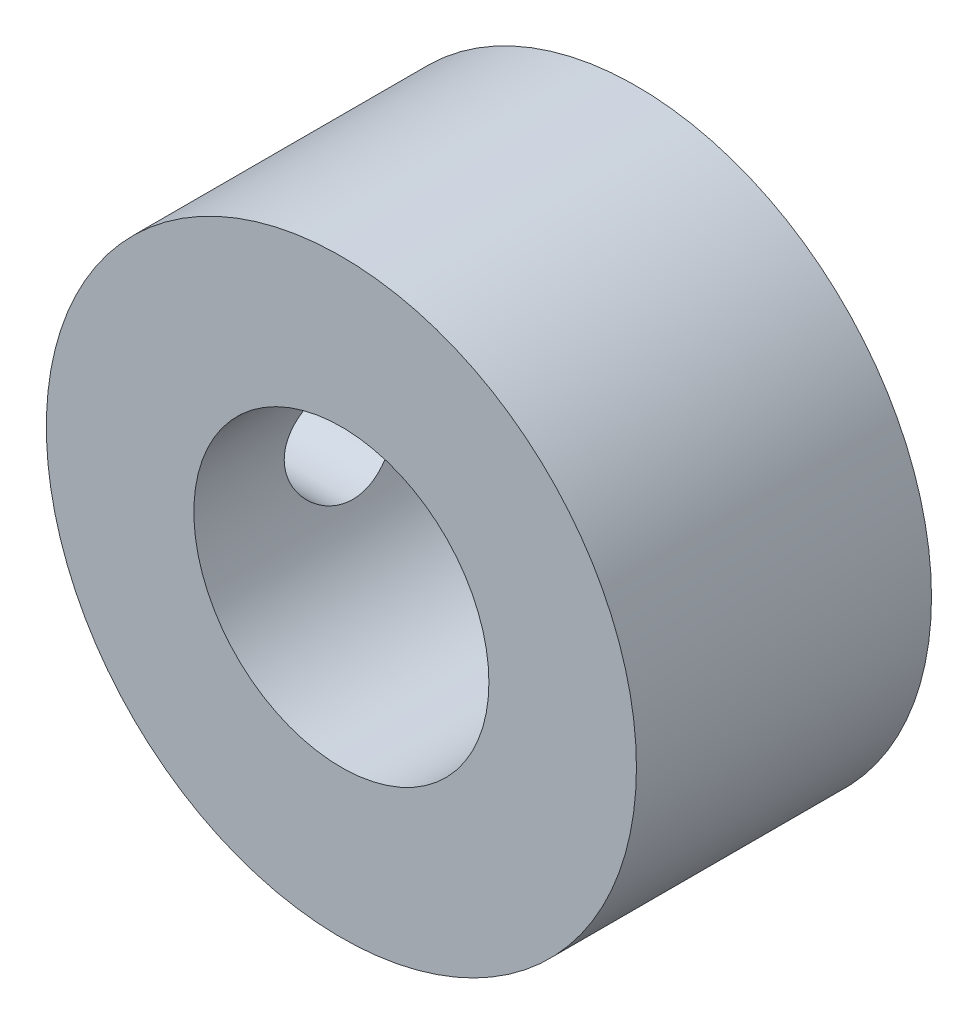
ISO-10303-21;
HEADER;
FILE_DESCRIPTION(('STEP AP214'),'2;1');
FILE_NAME('part.step','',(''),(''),'','','');
FILE_SCHEMA(('AUTOMOTIVE_DESIGN { 1 0 10303 214 1 1 1 1 }'));
ENDSEC;
DATA;
#1=APPLICATION_CONTEXT('core data for automotive mechanical design processes');
#2=APPLICATION_PROTOCOL_DEFINITION('international standard','automotive_design',2000,#1);
#3=PRODUCT_CONTEXT('',#1,'mechanical');
#4=PRODUCT('Part','Part','',(#3));
#5=PRODUCT_RELATED_PRODUCT_CATEGORY('part','',(#4));
#6=PRODUCT_DEFINITION_FORMATION('','',#4);
#7=PRODUCT_DEFINITION_CONTEXT('part definition',#1,'design');
#8=PRODUCT_DEFINITION('design','',#6,#7);
#9=PRODUCT_DEFINITION_SHAPE('','',#8);
#10=(LENGTH_UNIT() NAMED_UNIT(*) SI_UNIT(.MILLI.,.METRE.));
#11=(NAMED_UNIT(*) PLANE_ANGLE_UNIT() SI_UNIT($,.RADIAN.));
#12=(NAMED_UNIT(*) SI_UNIT($,.STERADIAN.) SOLID_ANGLE_UNIT());
#13=UNCERTAINTY_MEASURE_WITH_UNIT(LENGTH_MEASURE(1.E-05),#10,'distance_accuracy_value','');
#14=(GEOMETRIC_REPRESENTATION_CONTEXT(3) GLOBAL_UNCERTAINTY_ASSIGNED_CONTEXT((#13)) GLOBAL_UNIT_ASSIGNED_CONTEXT((#10,
#11,#12)) REPRESENTATION_CONTEXT('',''));
#15=CARTESIAN_POINT('',(0.,0.,0.));
#16=DIRECTION('',(0.,0.,1.));
#17=DIRECTION('',(1.,0.,0.));
#18=AXIS2_PLACEMENT_3D('',#15,#16,#17);
#19=CARTESIAN_POINT('',(0.,0.,8.));
#20=DIRECTION('',(0.,0.,1.));
#21=DIRECTION('',(1.,0.,0.));
#22=AXIS2_PLACEMENT_3D('',#19,#20,#21);
#23=PLANE('',#22);
#24=CARTESIAN_POINT('',(0.,0.,8.));
#25=DIRECTION('',(0.,0.,1.));
#26=DIRECTION('',(1.,0.,0.));
#27=AXIS2_PLACEMENT_3D('',#24,#25,#26);
#28=CIRCLE('',#27,8.);
#29=CARTESIAN_POINT('',(8.,0.,8.));
#30=VERTEX_POINT('',#29);
#31=EDGE_CURVE('E10',#30,#30,#28,.T.);
#32=ORIENTED_EDGE('',*,*,#31,.T.);
#33=EDGE_LOOP('',(#32));
#34=FACE_BOUND('',#33,.T.);
#35=CARTESIAN_POINT('',(0.,0.,8.));
#36=DIRECTION('',(0.,0.,1.));
#37=DIRECTION('',(1.,0.,0.));
#38=AXIS2_PLACEMENT_3D('',#35,#36,#37);
#39=CIRCLE('',#38,4.);
#40=CARTESIAN_POINT('',(4.,0.,8.));
#41=VERTEX_POINT('',#40);
#42=EDGE_CURVE('E57',#41,#41,#39,.T.);
#43=ORIENTED_EDGE('',*,*,#42,.F.);
#44=EDGE_LOOP('',(#43));
#45=FACE_BOUND('',#44,.T.);
#46=ADVANCED_FACE('F37',(#34,#45),#23,.T.);
#47=CARTESIAN_POINT('',(0.,0.,0.));
#48=DIRECTION('',(0.,0.,1.));
#49=DIRECTION('',(1.,0.,0.));
#50=AXIS2_PLACEMENT_3D('',#47,#48,#49);
#51=PLANE('',#50);
#52=CARTESIAN_POINT('',(0.,0.,0.));
#53=DIRECTION('',(0.,0.,1.));
#54=DIRECTION('',(1.,0.,0.));
#55=AXIS2_PLACEMENT_3D('',#52,#53,#54);
#56=CIRCLE('',#55,8.);
#57=CARTESIAN_POINT('',(8.,0.,0.));
#58=VERTEX_POINT('',#57);
#59=EDGE_CURVE('E51',#58,#58,#56,.T.);
#60=ORIENTED_EDGE('',*,*,#59,.F.);
#61=EDGE_LOOP('',(#60));
#62=FACE_BOUND('',#61,.T.);
#63=CARTESIAN_POINT('',(0.,0.,0.));
#64=DIRECTION('',(0.,0.,1.));
#65=DIRECTION('',(1.,0.,0.));
#66=AXIS2_PLACEMENT_3D('',#63,#64,#65);
#67=CIRCLE('',#66,4.);
#68=CARTESIAN_POINT('',(4.,0.,0.));
#69=VERTEX_POINT('',#68);
#70=EDGE_CURVE('E59',#69,#69,#67,.T.);
#71=ORIENTED_EDGE('',*,*,#70,.T.);
#72=EDGE_LOOP('',(#71));
#73=FACE_BOUND('',#72,.T.);
#74=ADVANCED_FACE('F82',(#62,#73),#51,.F.);
#75=CARTESIAN_POINT('',(0.,0.,8.));
#76=DIRECTION('',(0.,0.,-1.));
#77=DIRECTION('',(-1.,0.,0.));
#78=AXIS2_PLACEMENT_3D('',#75,#76,#77);
#79=CYLINDRICAL_SURFACE('',#78,8.);
#80=CARTESIAN_POINT('',(-8.,0.,2.45));
#81=CARTESIAN_POINT('',(-7.99999842280321,-0.0862000090560727,2.45000323506234));
#82=CARTESIAN_POINT('',(-7.99859244950264,-0.172441514582273,2.45721504765267));
#83=CARTESIAN_POINT('',(-7.99311930778483,-0.342490617447966,2.48585104477911));
#84=CARTESIAN_POINT('',(-7.98904995831119,-0.426296161166576,2.50728687765917));
#85=CARTESIAN_POINT('',(-7.97870487543911,-0.588989793717811,2.5636869294052));
#86=CARTESIAN_POINT('',(-7.97243119476004,-0.66788237741285,2.59863856510776));
#87=CARTESIAN_POINT('',(-7.95836101466986,-0.818677267895582,2.6810415234324));
#88=CARTESIAN_POINT('',(-7.95056462242915,-0.890580066100291,2.72849196645419));
#89=CARTESIAN_POINT('',(-7.93419720784637,-1.02627735016224,2.83518732487059));
#90=CARTESIAN_POINT('',(-7.92561835612107,-1.08996986367007,2.89456074275676));
#91=CARTESIAN_POINT('',(-7.90871045383984,-1.20655602201015,3.02314032180938));
#92=CARTESIAN_POINT('',(-7.90038142202523,-1.25944885837717,3.09234721845414));
#93=CARTESIAN_POINT('',(-7.88483993293564,-1.35336324284206,3.2393562115293));
#94=CARTESIAN_POINT('',(-7.87763756031106,-1.39428014474203,3.3172263197497));
#95=CARTESIAN_POINT('',(-7.86527562393695,-1.46241103269187,3.47889847196981));
#96=CARTESIAN_POINT('',(-7.86011587147091,-1.48962628469255,3.56269996712837));
#97=CARTESIAN_POINT('',(-7.85250239060556,-1.52925220095508,3.7327619824027));
#98=CARTESIAN_POINT('',(-7.85001608747069,-1.54184123479369,3.81897945321316));
#99=CARTESIAN_POINT('',(-7.84793288411762,-1.55241119677999,3.99233591578889));
#100=CARTESIAN_POINT('',(-7.8483357069624,-1.55039352505244,4.07947481843084));
#101=CARTESIAN_POINT('',(-7.85195561402892,-1.53195177741561,4.2509020793753));
#102=CARTESIAN_POINT('',(-7.85513291659774,-1.51573133777981,4.33521330911359));
#103=CARTESIAN_POINT('',(-7.8638812199749,-1.46966555159005,4.49989471565601));
#104=CARTESIAN_POINT('',(-7.86945232872296,-1.43981959064035,4.58026471456298));
#105=CARTESIAN_POINT('',(-7.88240165698287,-1.36715315209463,4.73537365758859));
#106=CARTESIAN_POINT('',(-7.88979116772949,-1.32425119437673,4.81007344773184));
#107=CARTESIAN_POINT('',(-7.90553732992766,-1.22674814971849,4.95129032695716));
#108=CARTESIAN_POINT('',(-7.91389408590109,-1.17214579787347,5.01780653010425));
#109=CARTESIAN_POINT('',(-7.93080599268302,-1.0516977592376,5.1419438932694));
#110=CARTESIAN_POINT('',(-7.93936211336833,-0.985678079341879,5.19939623218059));
#111=CARTESIAN_POINT('',(-7.9555794764229,-0.844849674944187,5.30243672403183));
#112=CARTESIAN_POINT('',(-7.96324070862711,-0.770040850625477,5.34802474221201));
#113=CARTESIAN_POINT('',(-7.97682216610372,-0.613575982254087,5.42607051054377));
#114=CARTESIAN_POINT('',(-7.98273994653886,-0.531910527300614,5.45850984605129));
#115=CARTESIAN_POINT('',(-7.99214900770226,-0.364149126216177,5.50916215364845));
#116=CARTESIAN_POINT('',(-7.99564056396556,-0.278053684371442,5.52737674120598));
#117=CARTESIAN_POINT('',(-7.99976566694373,-0.105327839678056,5.54882554297746));
#118=CARTESIAN_POINT('',(-8.0004433137256,-0.0187271634665921,5.55229093090906));
#119=CARTESIAN_POINT('',(-7.99898639516866,0.153815986945028,5.54476428491212));
#120=CARTESIAN_POINT('',(-7.99685197777301,0.239758495532241,5.53377301155098));
#121=CARTESIAN_POINT('',(-7.99003828417804,0.407806296409092,5.49783717788485));
#122=CARTESIAN_POINT('',(-7.98538049876911,0.489937723225295,5.47301040007483));
#123=CARTESIAN_POINT('',(-7.97404029109997,0.648872205621883,5.41023637156318));
#124=CARTESIAN_POINT('',(-7.9673577242492,0.725674880192138,5.37228818382841));
#125=CARTESIAN_POINT('',(-7.95259926490459,0.872752578183276,5.2838425811838));
#126=CARTESIAN_POINT('',(-7.94450813353157,0.942941710588031,5.2332049323343));
#127=CARTESIAN_POINT('',(-7.92786761642388,1.07390931417531,5.1210066011082));
#128=CARTESIAN_POINT('',(-7.91931818484817,1.13468684159774,5.05944482462798));
#129=CARTESIAN_POINT('',(-7.90257717759425,1.24599121245429,4.9260962795544));
#130=CARTESIAN_POINT('',(-7.89439242829046,1.29635982413068,4.85417643447761));
#131=CARTESIAN_POINT('',(-7.8794483827518,1.38430167523507,4.70276092004217));
#132=CARTESIAN_POINT('',(-7.8726890314408,1.42187540908056,4.62326554356788));
#133=CARTESIAN_POINT('',(-7.86141544092827,1.4829406625322,4.45934417224119));
#134=CARTESIAN_POINT('',(-7.85688997843683,1.50650270327783,4.3749452567914));
#135=CARTESIAN_POINT('',(-7.85057181400504,1.53909150160862,4.20328993727386));
#136=CARTESIAN_POINT('',(-7.84877878027309,1.54812002396799,4.11603388145567));
#137=CARTESIAN_POINT('',(-7.84814610403894,1.5513233485036,3.94272791834174));
#138=CARTESIAN_POINT('',(-7.84925679188613,1.54574795503267,3.85668271146533));
#139=CARTESIAN_POINT('',(-7.85419586161266,1.52045079539904,3.68678117511438));
#140=CARTESIAN_POINT('',(-7.85802422457316,1.50072912771433,3.60292483040649));
#141=CARTESIAN_POINT('',(-7.86794572797401,1.4478076418963,3.43992787351762));
#142=CARTESIAN_POINT('',(-7.87403402378803,1.41463664120812,3.3607775910046));
#143=CARTESIAN_POINT('',(-7.88779248725543,1.33578606149653,3.2091262735255));
#144=CARTESIAN_POINT('',(-7.89546277702584,1.29010551674905,3.13662575249132));
#145=CARTESIAN_POINT('',(-7.91167407868071,1.18667159674348,2.99908430633506));
#146=CARTESIAN_POINT('',(-7.92022703770621,1.12873710362045,2.93418096947979));
#147=CARTESIAN_POINT('',(-7.93715240007839,1.00281570181795,2.8149341738807));
#148=CARTESIAN_POINT('',(-7.94552476150182,0.934826487245944,2.76059314406964));
#149=CARTESIAN_POINT('',(-7.96124124716936,0.789933072815974,2.66351765146197));
#150=CARTESIAN_POINT('',(-7.96857459292986,0.712948687376799,2.62090106423945));
#151=CARTESIAN_POINT('',(-7.98128114701078,0.552792962431646,2.54927595603447));
#152=CARTESIAN_POINT('',(-7.98665615895217,0.469627401220561,2.52025490651496));
#153=CARTESIAN_POINT('',(-7.99376993370221,0.321871061162896,2.48240369033393));
#154=CARTESIAN_POINT('',(-7.99609278018456,0.258133187842329,2.47027351247794));
#155=CARTESIAN_POINT('',(-7.99920838449221,0.129604676449406,2.45407056583467));
#156=CARTESIAN_POINT('',(-8.00000118589942,0.064814068416229,2.44999756754606));
#157=CARTESIAN_POINT('',(-8.,0.,2.45));
#158=B_SPLINE_CURVE_WITH_KNOTS('',3,(#80,#81,#82,#83,#84,#85,#86,#87,#88,#89,#90,#91,#92,#93,
#94,#95,#96,#97,#98,#99,#100,#101,#102,#103,#104,#105,#106,#107,#108,#109,#110,#111,#112,#113,
#114,#115,#116,#117,#118,#119,#120,#121,#122,#123,#124,#125,#126,#127,#128,#129,#130,#131,#132,
#133,#134,#135,#136,#137,#138,#139,#140,#141,#142,#143,#144,#145,#146,#147,#148,#149,#150,#151,
#152,#153,#154,#155,#156,#157),.UNSPECIFIED.,.T.,.F.,(4,2,2,2,2,2,2,2,2,2,2,2,2,2,2,2,2,2,2,2,2,
2,2,2,2,2,2,2,2,2,2,2,2,2,2,2,2,2,4),(0.,0.25836295881954,0.516937757947955,0.775272402208295,
1.03358887109088,1.29485526419773,1.55614120857562,1.81964642084703,2.08312728233678,
2.34336004904478,2.6035678714891,2.86010487745126,3.11665345220478,3.3748371276435,
3.63304872886352,3.8956124518134,4.15817915694069,4.42111232492289,4.68401562792029,
4.94278274421265,5.20153624726778,5.45811989342285,5.71472186665191,5.97429534799386,
6.23389484154963,6.49718968196383,6.76047434702859,7.02242242662094,7.2843386960156,
7.54180418298673,7.79926787765262,8.05618280428257,8.31311757007748,8.57415474091679,
8.83525186963593,9.09888533019473,9.36227536746883,9.55654485391841,9.75080880670125),.UNSPECIFIED.);
#159=CARTESIAN_POINT('',(-8.,0.,2.45));
#160=VERTEX_POINT('',#159);
#161=EDGE_CURVE('E66',#160,#160,#158,.T.);
#162=ORIENTED_EDGE('',*,*,#161,.F.);
#163=EDGE_LOOP('',(#162));
#164=FACE_BOUND('',#163,.T.);
#165=ORIENTED_EDGE('',*,*,#31,.F.);
#166=EDGE_LOOP('',(#165));
#167=FACE_BOUND('',#166,.T.);
#168=ORIENTED_EDGE('',*,*,#59,.T.);
#169=EDGE_LOOP('',(#168));
#170=FACE_BOUND('',#169,.T.);
#171=ADVANCED_FACE('F39',(#164,#167,#170),#79,.T.);
#172=CARTESIAN_POINT('',(0.,0.,8.));
#173=DIRECTION('',(0.,0.,-1.));
#174=DIRECTION('',(-1.,0.,0.));
#175=AXIS2_PLACEMENT_3D('',#172,#173,#174);
#176=CYLINDRICAL_SURFACE('',#175,4.);
#177=CARTESIAN_POINT('',(-4.,0.,5.55));
#178=CARTESIAN_POINT('',(-4.00000307103966,-0.0837418170105696,5.55000400873315));
#179=CARTESIAN_POINT('',(-3.9973478314409,-0.167457172373492,5.54319266298363));
#180=CARTESIAN_POINT('',(-3.98702237503302,-0.332375207740033,5.51624643486542));
#181=CARTESIAN_POINT('',(-3.97935324557983,-0.413578428549003,5.49611444131733));
#182=CARTESIAN_POINT('',(-3.95981985493208,-0.571068953775959,5.44335311930911));
#183=CARTESIAN_POINT('',(-3.94796402326925,-0.647365774547913,5.41074889161957));
#184=CARTESIAN_POINT('',(-3.92122905980691,-0.793397990414404,5.33410079026117));
#185=CARTESIAN_POINT('',(-3.9063490629407,-0.86313149969484,5.29005364232347));
#186=CARTESIAN_POINT('',(-3.8743461117322,-0.997188457700879,5.18970858797203));
#187=CARTESIAN_POINT('',(-3.85715676295881,-1.06117882783834,5.13298709564871));
#188=CARTESIAN_POINT('',(-3.82278777553389,-1.17901131840263,5.00980270060039));
#189=CARTESIAN_POINT('',(-3.80560814209105,-1.23285001917138,4.94333652866875));
#190=CARTESIAN_POINT('',(-3.77241707577085,-1.33104129410195,4.79921144537994));
#191=CARTESIAN_POINT('',(-3.75648304078581,-1.37491107737843,4.72120397978217));
#192=CARTESIAN_POINT('',(-3.7286279787642,-1.44875905604124,4.55820486220747));
#193=CARTESIAN_POINT('',(-3.71670522553814,-1.47874322896953,4.47321623409981));
#194=CARTESIAN_POINT('',(-3.69893619719526,-1.52263359505666,4.30251081398875));
#195=CARTESIAN_POINT('',(-3.69284964987085,-1.53717845025292,4.21698411834876));
#196=CARTESIAN_POINT('',(-3.686742208991,-1.55177347407324,4.04450396142939));
#197=CARTESIAN_POINT('',(-3.68671858716909,-1.55183016225289,3.95755115950248));
#198=CARTESIAN_POINT('',(-3.69253360906918,-1.53793335557094,3.79067180499645));
#199=CARTESIAN_POINT('',(-3.69799366796117,-1.52488463668498,3.71065421105799));
#200=CARTESIAN_POINT('',(-3.71352858031644,-1.48664952044108,3.55404855565121));
#201=CARTESIAN_POINT('',(-3.72360417780325,-1.46146116614316,3.47746104929796));
#202=CARTESIAN_POINT('',(-3.74745019933858,-1.39919376657937,3.32811190876055));
#203=CARTESIAN_POINT('',(-3.76128946343745,-1.36189037494605,3.25545528868872));
#204=CARTESIAN_POINT('',(-3.79108253096821,-1.27660867855489,3.11717789701085));
#205=CARTESIAN_POINT('',(-3.80703709727107,-1.22862651830679,3.05155967928033));
#206=CARTESIAN_POINT('',(-3.84066621512758,-1.1192765867249,2.92424051500034));
#207=CARTESIAN_POINT('',(-3.85838181074213,-1.05719282693901,2.8631637700317));
#208=CARTESIAN_POINT('',(-3.89255270828944,-0.92346718429924,2.7520960092834));
#209=CARTESIAN_POINT('',(-3.90900778906909,-0.851823630229687,2.70210693589566));
#210=CARTESIAN_POINT('',(-3.93917140871768,-0.699332321527983,2.61388162833238));
#211=CARTESIAN_POINT('',(-3.95282680746144,-0.618345361125566,2.57586652540862));
#212=CARTESIAN_POINT('',(-3.97545468791428,-0.450463577524199,2.51421123139958));
#213=CARTESIAN_POINT('',(-3.98442939616062,-0.363571585538861,2.49056420474168));
#214=CARTESIAN_POINT('',(-3.99628616226532,-0.19158931053644,2.45954699937968));
#215=CARTESIAN_POINT('',(-3.99948214473611,-0.106672001209173,2.45133711455847));
#216=CARTESIAN_POINT('',(-4.0004007065522,0.0633780229217711,2.44896521737407));
#217=CARTESIAN_POINT('',(-3.99812459874478,0.148510681164301,2.45479983549684));
#218=CARTESIAN_POINT('',(-3.98856115851297,0.312858974622368,2.47972303183587));
#219=CARTESIAN_POINT('',(-3.98148622105735,0.392173433269957,2.49825017699552));
#220=CARTESIAN_POINT('',(-3.96325324682584,0.546503715363222,2.54728113787909));
#221=CARTESIAN_POINT('',(-3.95209468123897,0.621518980627428,2.57778650476476));
#222=CARTESIAN_POINT('',(-3.92637006174119,0.767652849526817,2.65089475093679));
#223=CARTESIAN_POINT('',(-3.91171167856455,0.838586587400797,2.69383365325519));
#224=CARTESIAN_POINT('',(-3.88059327622917,0.972485884255151,2.79021394129089));
#225=CARTESIAN_POINT('',(-3.86413256303816,1.03544835343259,2.84365937915851));
#226=CARTESIAN_POINT('',(-3.82994670072776,1.15570630052789,2.96342769680112));
#227=CARTESIAN_POINT('',(-3.81220642219352,1.21240855982172,3.03034345829148));
#228=CARTESIAN_POINT('',(-3.7784267775271,1.31391042842011,3.17307301466637));
#229=CARTESIAN_POINT('',(-3.76238762343853,1.35870855493065,3.24888791634508));
#230=CARTESIAN_POINT('',(-3.73385097634257,1.43528626427412,3.40813284446921));
#231=CARTESIAN_POINT('',(-3.72137804867911,1.46697619056479,3.491610692979));
#232=CARTESIAN_POINT('',(-3.70183589219826,1.51562246992129,3.66334182538571));
#233=CARTESIAN_POINT('',(-3.69476300684656,1.53258879385557,3.75159183447074));
#234=CARTESIAN_POINT('',(-3.68732874278393,1.55038415337445,3.92388605590885));
#235=CARTESIAN_POINT('',(-3.68654305278754,1.55223359693949,4.00780733372688));
#236=CARTESIAN_POINT('',(-3.69067248938598,1.54238929517269,4.17470062796814));
#237=CARTESIAN_POINT('',(-3.69558699502441,1.53069702502093,4.25767274679468));
#238=CARTESIAN_POINT('',(-3.71019928004619,1.49491544189353,4.4173658961104));
#239=CARTESIAN_POINT('',(-3.7197245672776,1.471271918625,4.49420398956875));
#240=CARTESIAN_POINT('',(-3.74237408260303,1.41266354169454,4.64286076797012));
#241=CARTESIAN_POINT('',(-3.7554992479164,1.37769573935543,4.714678139662));
#242=CARTESIAN_POINT('',(-3.7847652300439,1.29520837732455,4.85554561556422));
#243=CARTESIAN_POINT('',(-3.80103203424639,1.24710518862183,4.92422742307261));
#244=CARTESIAN_POINT('',(-3.83434014261162,1.1405907131212,5.0528684986922));
#245=CARTESIAN_POINT('',(-3.85138169981625,1.08217604027141,5.11282488974391));
#246=CARTESIAN_POINT('',(-3.88553398671661,0.95255968221614,5.22595139733108));
#247=CARTESIAN_POINT('',(-3.90258881429735,0.880804909103499,5.27850769951102));
#248=CARTESIAN_POINT('',(-3.93379551376096,0.728878495223067,5.37081661776278));
#249=CARTESIAN_POINT('',(-3.94794681660584,0.648705209225497,5.41056672492218));
#250=CARTESIAN_POINT('',(-3.97259068830064,0.476070144268091,5.47819087909504));
#251=CARTESIAN_POINT('',(-3.98274647341979,0.383139212843739,5.50500380212522));
#252=CARTESIAN_POINT('',(-3.99644738728565,0.193458883629429,5.54090076806915));
#253=CARTESIAN_POINT('',(-3.99999645331605,0.0967117952157209,5.54999537039208));
#254=CARTESIAN_POINT('',(-4.,0.,5.55));
#255=B_SPLINE_CURVE_WITH_KNOTS('',3,(#177,#178,#179,#180,#181,#182,#183,#184,#185,#186,#187,
#188,#189,#190,#191,#192,#193,#194,#195,#196,#197,#198,#199,#200,#201,#202,#203,#204,#205,#206,
#207,#208,#209,#210,#211,#212,#213,#214,#215,#216,#217,#218,#219,#220,#221,#222,#223,#224,#225,
#226,#227,#228,#229,#230,#231,#232,#233,#234,#235,#236,#237,#238,#239,#240,#241,#242,#243,#244,
#245,#246,#247,#248,#249,#250,#251,#252,#253,#254),.UNSPECIFIED.,.T.,.F.,(4,2,2,2,2,2,2,2,2,2,2,
2,2,2,2,2,2,2,2,2,2,2,2,2,2,2,2,2,2,2,2,2,2,2,2,2,2,2,4),(0.,0.250868506659483,
0.501682625822805,0.751994606804863,1.00237829091529,1.26289324584923,1.52349580083106,
1.79484593304449,2.06607914435899,2.32559405583375,2.58499218753425,2.82763403872306,
3.07031501748276,3.31777403042842,3.56532253197279,3.83073141369118,4.09618675436141,
4.36629046146055,4.63626556664624,4.89107530662835,5.14582391953313,5.38997552487789,
5.63415875792245,5.88568062986168,6.1372996995035,6.40451611555109,6.67176580083181,
6.94081432578584,7.20968050775751,7.46023414456831,7.71076048963594,7.95256448228419,
8.19443148785929,8.44957507206159,8.70480259588002,8.9751752520618,9.24560084585601,
9.53549682269166,9.82521998022792),.UNSPECIFIED.);
#256=CARTESIAN_POINT('',(-4.,0.,5.55));
#257=VERTEX_POINT('',#256);
#258=EDGE_CURVE('E41',#257,#257,#255,.T.);
#259=ORIENTED_EDGE('',*,*,#258,.F.);
#260=EDGE_LOOP('',(#259));
#261=FACE_BOUND('',#260,.T.);
#262=ORIENTED_EDGE('',*,*,#42,.T.);
#263=EDGE_LOOP('',(#262));
#264=FACE_BOUND('',#263,.T.);
#265=ORIENTED_EDGE('',*,*,#70,.F.);
#266=EDGE_LOOP('',(#265));
#267=FACE_BOUND('',#266,.T.);
#268=ADVANCED_FACE('F76',(#261,#264,#267),#176,.F.);
#269=CARTESIAN_POINT('',(-8.001,0.,4.));
#270=DIRECTION('',(1.,0.,0.));
#271=DIRECTION('',(0.,0.,-1.));
#272=AXIS2_PLACEMENT_3D('',#269,#270,#271);
#273=CYLINDRICAL_SURFACE('',#272,1.55);
#274=ORIENTED_EDGE('',*,*,#258,.T.);
#275=EDGE_LOOP('',(#274));
#276=FACE_BOUND('',#275,.T.);
#277=ORIENTED_EDGE('',*,*,#161,.T.);
#278=EDGE_LOOP('',(#277));
#279=FACE_BOUND('',#278,.T.);
#280=ADVANCED_FACE('F73',(#276,#279),#273,.F.);
#281=CLOSED_SHELL('',(#46,#74,#171,#268,#280));
#282=MANIFOLD_SOLID_BREP('B2',#281);
#283=ADVANCED_BREP_SHAPE_REPRESENTATION('',(#18,#282),#14);
#284=SHAPE_DEFINITION_REPRESENTATION(#9,#283);
ENDSEC;
END-ISO-10303-21;
